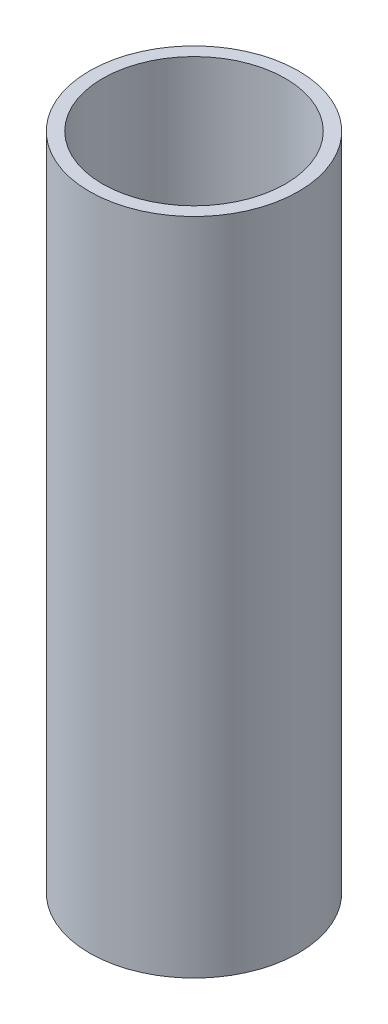
ISO-10303-21;
HEADER;
FILE_DESCRIPTION(('STEP AP214'),'2;1');
FILE_NAME('part.step','',(''),(''),'','','');
FILE_SCHEMA(('AUTOMOTIVE_DESIGN { 1 0 10303 214 1 1 1 1 }'));
ENDSEC;
DATA;
#1=APPLICATION_CONTEXT('core data for automotive mechanical design processes');
#2=APPLICATION_PROTOCOL_DEFINITION('international standard','automotive_design',2000,#1);
#3=PRODUCT_CONTEXT('',#1,'mechanical');
#4=PRODUCT('Part','Part','',(#3));
#5=PRODUCT_RELATED_PRODUCT_CATEGORY('part','',(#4));
#6=PRODUCT_DEFINITION_FORMATION('','',#4);
#7=PRODUCT_DEFINITION_CONTEXT('part definition',#1,'design');
#8=PRODUCT_DEFINITION('design','',#6,#7);
#9=PRODUCT_DEFINITION_SHAPE('','',#8);
#10=(LENGTH_UNIT() NAMED_UNIT(*) SI_UNIT(.MILLI.,.METRE.));
#11=(NAMED_UNIT(*) PLANE_ANGLE_UNIT() SI_UNIT($,.RADIAN.));
#12=(NAMED_UNIT(*) SI_UNIT($,.STERADIAN.) SOLID_ANGLE_UNIT());
#13=UNCERTAINTY_MEASURE_WITH_UNIT(LENGTH_MEASURE(1.E-05),#10,'distance_accuracy_value','');
#14=(GEOMETRIC_REPRESENTATION_CONTEXT(3) GLOBAL_UNCERTAINTY_ASSIGNED_CONTEXT((#13)) GLOBAL_UNIT_ASSIGNED_CONTEXT((#10,
#11,#12)) REPRESENTATION_CONTEXT('',''));
#15=CARTESIAN_POINT('',(0.,0.,0.));
#16=DIRECTION('',(0.,0.,1.));
#17=DIRECTION('',(1.,0.,0.));
#18=AXIS2_PLACEMENT_3D('',#15,#16,#17);
#19=CARTESIAN_POINT('',(0.,50.5,0.));
#20=DIRECTION('',(0.,1.,0.));
#21=DIRECTION('',(0.,0.,1.));
#22=AXIS2_PLACEMENT_3D('',#19,#20,#21);
#23=PLANE('',#22);
#24=CARTESIAN_POINT('',(0.,50.5,0.));
#25=DIRECTION('',(0.,1.,0.));
#26=DIRECTION('',(0.,0.,1.));
#27=AXIS2_PLACEMENT_3D('',#24,#25,#26);
#28=CIRCLE('',#27,8.);
#29=CARTESIAN_POINT('',(0.,50.5,8.));
#30=VERTEX_POINT('',#29);
#31=EDGE_CURVE('E10',#30,#30,#28,.T.);
#32=ORIENTED_EDGE('',*,*,#31,.T.);
#33=EDGE_LOOP('',(#32));
#34=FACE_BOUND('',#33,.T.);
#35=CARTESIAN_POINT('',(0.,50.5,0.));
#36=DIRECTION('',(0.,1.,0.));
#37=DIRECTION('',(0.,0.,1.));
#38=AXIS2_PLACEMENT_3D('',#35,#36,#37);
#39=CIRCLE('',#38,7.);
#40=CARTESIAN_POINT('',(0.,50.5,7.));
#41=VERTEX_POINT('',#40);
#42=EDGE_CURVE('E50',#41,#41,#39,.T.);
#43=ORIENTED_EDGE('',*,*,#42,.F.);
#44=EDGE_LOOP('',(#43));
#45=FACE_BOUND('',#44,.T.);
#46=ADVANCED_FACE('F37',(#34,#45),#23,.T.);
#47=CARTESIAN_POINT('',(0.,0.,0.));
#48=DIRECTION('',(0.,1.,0.));
#49=DIRECTION('',(0.,0.,1.));
#50=AXIS2_PLACEMENT_3D('',#47,#48,#49);
#51=PLANE('',#50);
#52=CARTESIAN_POINT('',(0.,0.,0.));
#53=DIRECTION('',(0.,1.,0.));
#54=DIRECTION('',(0.,0.,1.));
#55=AXIS2_PLACEMENT_3D('',#52,#53,#54);
#56=CIRCLE('',#55,8.);
#57=CARTESIAN_POINT('',(0.,0.,8.));
#58=VERTEX_POINT('',#57);
#59=EDGE_CURVE('E41',#58,#58,#56,.T.);
#60=ORIENTED_EDGE('',*,*,#59,.F.);
#61=EDGE_LOOP('',(#60));
#62=FACE_BOUND('',#61,.T.);
#63=CARTESIAN_POINT('',(0.,0.,0.));
#64=DIRECTION('',(0.,1.,0.));
#65=DIRECTION('',(0.,0.,1.));
#66=AXIS2_PLACEMENT_3D('',#63,#64,#65);
#67=CIRCLE('',#66,7.);
#68=CARTESIAN_POINT('',(0.,0.,7.));
#69=VERTEX_POINT('',#68);
#70=EDGE_CURVE('E52',#69,#69,#67,.T.);
#71=ORIENTED_EDGE('',*,*,#70,.T.);
#72=EDGE_LOOP('',(#71));
#73=FACE_BOUND('',#72,.T.);
#74=ADVANCED_FACE('F64',(#62,#73),#51,.F.);
#75=CARTESIAN_POINT('',(0.,50.5,0.));
#76=DIRECTION('',(0.,-1.,0.));
#77=DIRECTION('',(0.,0.,-1.));
#78=AXIS2_PLACEMENT_3D('',#75,#76,#77);
#79=CYLINDRICAL_SURFACE('',#78,8.);
#80=ORIENTED_EDGE('',*,*,#31,.F.);
#81=EDGE_LOOP('',(#80));
#82=FACE_BOUND('',#81,.T.);
#83=ORIENTED_EDGE('',*,*,#59,.T.);
#84=EDGE_LOOP('',(#83));
#85=FACE_BOUND('',#84,.T.);
#86=ADVANCED_FACE('F39',(#82,#85),#79,.T.);
#87=CARTESIAN_POINT('',(0.,50.5,0.));
#88=DIRECTION('',(0.,-1.,0.));
#89=DIRECTION('',(0.,0.,-1.));
#90=AXIS2_PLACEMENT_3D('',#87,#88,#89);
#91=CYLINDRICAL_SURFACE('',#90,7.);
#92=ORIENTED_EDGE('',*,*,#42,.T.);
#93=EDGE_LOOP('',(#92));
#94=FACE_BOUND('',#93,.T.);
#95=ORIENTED_EDGE('',*,*,#70,.F.);
#96=EDGE_LOOP('',(#95));
#97=FACE_BOUND('',#96,.T.);
#98=ADVANCED_FACE('F60',(#94,#97),#91,.F.);
#99=CLOSED_SHELL('',(#46,#74,#86,#98));
#100=MANIFOLD_SOLID_BREP('B2',#99);
#101=ADVANCED_BREP_SHAPE_REPRESENTATION('',(#18,#100),#14);
#102=SHAPE_DEFINITION_REPRESENTATION(#9,#101);
ENDSEC;
END-ISO-10303-21;
